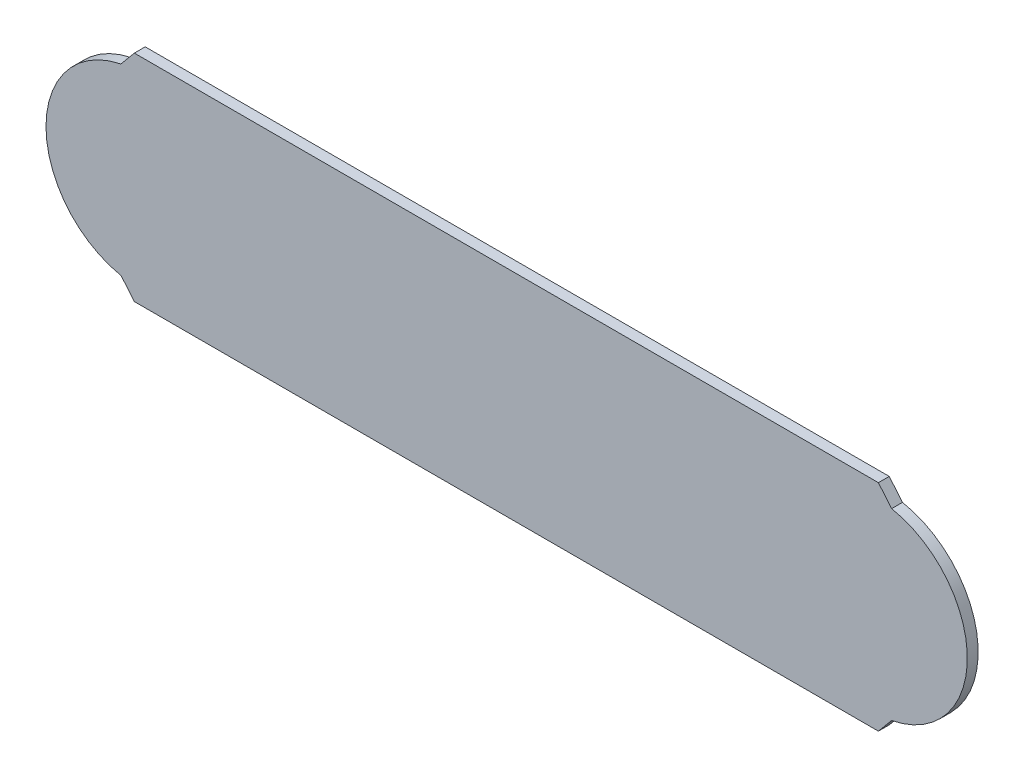
ISO-10303-21;
HEADER;
FILE_DESCRIPTION(('STEP AP214'),'2;1');
FILE_NAME('part.step','',(''),(''),'','','');
FILE_SCHEMA(('AUTOMOTIVE_DESIGN { 1 0 10303 214 1 1 1 1 }'));
ENDSEC;
DATA;
#1=APPLICATION_CONTEXT('core data for automotive mechanical design processes');
#2=APPLICATION_PROTOCOL_DEFINITION('international standard','automotive_design',2000,#1);
#3=PRODUCT_CONTEXT('',#1,'mechanical');
#4=PRODUCT('Part','Part','',(#3));
#5=PRODUCT_RELATED_PRODUCT_CATEGORY('part','',(#4));
#6=PRODUCT_DEFINITION_FORMATION('','',#4);
#7=PRODUCT_DEFINITION_CONTEXT('part definition',#1,'design');
#8=PRODUCT_DEFINITION('design','',#6,#7);
#9=PRODUCT_DEFINITION_SHAPE('','',#8);
#10=(LENGTH_UNIT() NAMED_UNIT(*) SI_UNIT(.MILLI.,.METRE.));
#11=(NAMED_UNIT(*) PLANE_ANGLE_UNIT() SI_UNIT($,.RADIAN.));
#12=(NAMED_UNIT(*) SI_UNIT($,.STERADIAN.) SOLID_ANGLE_UNIT());
#13=UNCERTAINTY_MEASURE_WITH_UNIT(LENGTH_MEASURE(1.E-05),#10,'distance_accuracy_value','');
#14=(GEOMETRIC_REPRESENTATION_CONTEXT(3) GLOBAL_UNCERTAINTY_ASSIGNED_CONTEXT((#13)) GLOBAL_UNIT_ASSIGNED_CONTEXT((#10,
#11,#12)) REPRESENTATION_CONTEXT('',''));
#15=CARTESIAN_POINT('',(0.,0.,0.));
#16=DIRECTION('',(0.,0.,1.));
#17=DIRECTION('',(1.,0.,0.));
#18=AXIS2_PLACEMENT_3D('',#15,#16,#17);
#19=CARTESIAN_POINT('',(25.7431576551753,-10.1499722540437,1.6));
#20=DIRECTION('',(-0.768638191384628,0.63968377402039,0.));
#21=DIRECTION('',(-0.639683774020389,-0.768638191384628,0.));
#22=AXIS2_PLACEMENT_3D('',#19,#20,#21);
#23=PLANE('',#22);
#24=DIRECTION('',(0.639683774020389,0.768638191384628,0.));
#25=VECTOR('',#24,1.);
#26=CARTESIAN_POINT('',(25.7431576551753,-10.1499722540437,0.4));
#27=LINE('',#26,#25);
#28=CARTESIAN_POINT('',(24.2809411612615,-11.9069582632884,0.4));
#29=VERTEX_POINT('',#28);
#30=CARTESIAN_POINT('',(25.7431576551753,-10.1499722540437,0.4));
#31=VERTEX_POINT('',#30);
#32=EDGE_CURVE('E141',#29,#31,#27,.T.);
#33=ORIENTED_EDGE('',*,*,#32,.T.);
#34=DIRECTION('',(0.,0.,-1.));
#35=VECTOR('',#34,1.);
#36=CARTESIAN_POINT('',(25.7431576551753,-10.1499722540437,1.6));
#37=LINE('',#36,#35);
#38=CARTESIAN_POINT('',(25.7431576551753,-10.1499722540437,1.6));
#39=VERTEX_POINT('',#38);
#40=EDGE_CURVE('E11',#39,#31,#37,.T.);
#41=ORIENTED_EDGE('',*,*,#40,.F.);
#42=DIRECTION('',(0.639683774020389,0.768638191384628,0.));
#43=VECTOR('',#42,1.);
#44=CARTESIAN_POINT('',(25.7431576551753,-10.1499722540437,1.6));
#45=LINE('',#44,#43);
#46=CARTESIAN_POINT('',(24.2809411612615,-11.9069582632884,1.6));
#47=VERTEX_POINT('',#46);
#48=EDGE_CURVE('E157',#47,#39,#45,.T.);
#49=ORIENTED_EDGE('',*,*,#48,.F.);
#50=DIRECTION('',(0.,0.,-1.));
#51=VECTOR('',#50,1.);
#52=CARTESIAN_POINT('',(24.2809411612615,-11.9069582632884,1.6));
#53=LINE('',#52,#51);
#54=EDGE_CURVE('E137',#47,#29,#53,.T.);
#55=ORIENTED_EDGE('',*,*,#54,.T.);
#56=EDGE_LOOP('',(#33,#41,#49,#55));
#57=FACE_BOUND('',#56,.T.);
#58=ADVANCED_FACE('F39',(#57),#23,.F.);
#59=CARTESIAN_POINT('',(23.7819147151548,-0.000454992943589456,1.6));
#60=DIRECTION('',(0.,0.,-1.));
#61=DIRECTION('',(-1.,0.,0.));
#62=AXIS2_PLACEMENT_3D('',#59,#60,#61);
#63=CYLINDRICAL_SURFACE('',#62,10.3372711342573);
#64=CARTESIAN_POINT('',(23.7819147151548,-0.000454992943589456,0.4));
#65=DIRECTION('',(0.,0.,1.));
#66=DIRECTION('',(1.,0.,0.));
#67=AXIS2_PLACEMENT_3D('',#64,#65,#66);
#68=CIRCLE('',#67,10.3372711342573);
#69=CARTESIAN_POINT('',(25.7431576551794,10.1490622681557,0.4));
#70=VERTEX_POINT('',#69);
#71=EDGE_CURVE('E144',#31,#70,#68,.T.);
#72=ORIENTED_EDGE('',*,*,#71,.T.);
#73=DIRECTION('',(0.,0.,-1.));
#74=VECTOR('',#73,1.);
#75=CARTESIAN_POINT('',(25.7431576551794,10.1490622681557,1.6));
#76=LINE('',#75,#74);
#77=CARTESIAN_POINT('',(25.7431576551794,10.1490622681557,1.6));
#78=VERTEX_POINT('',#77);
#79=EDGE_CURVE('E47',#78,#70,#76,.T.);
#80=ORIENTED_EDGE('',*,*,#79,.F.);
#81=CARTESIAN_POINT('',(23.7819147151548,-0.000454992943589456,1.6));
#82=DIRECTION('',(0.,0.,1.));
#83=DIRECTION('',(1.,0.,0.));
#84=AXIS2_PLACEMENT_3D('',#81,#82,#83);
#85=CIRCLE('',#84,10.3372711342573);
#86=EDGE_CURVE('E101',#39,#78,#85,.T.);
#87=ORIENTED_EDGE('',*,*,#86,.F.);
#88=ORIENTED_EDGE('',*,*,#40,.T.);
#89=EDGE_LOOP('',(#72,#80,#87,#88));
#90=FACE_BOUND('',#89,.T.);
#91=ADVANCED_FACE('F200',(#90),#63,.T.);
#92=CARTESIAN_POINT('',(25.7431576551794,10.1490622681557,1.6));
#93=DIRECTION('',(-0.768638191384177,-0.639683774020931,0.));
#94=DIRECTION('',(0.639683774020931,-0.768638191384177,0.));
#95=AXIS2_PLACEMENT_3D('',#92,#93,#94);
#96=PLANE('',#95);
#97=DIRECTION('',(-0.639683774020931,0.768638191384177,0.));
#98=VECTOR('',#97,1.);
#99=CARTESIAN_POINT('',(25.7431576551794,10.1490622681557,0.4));
#100=LINE('',#99,#98);
#101=CARTESIAN_POINT('',(24.2809411612615,11.9060482774028,0.4));
#102=VERTEX_POINT('',#101);
#103=EDGE_CURVE('E146',#70,#102,#100,.T.);
#104=ORIENTED_EDGE('',*,*,#103,.T.);
#105=DIRECTION('',(0.,0.,-1.));
#106=VECTOR('',#105,1.);
#107=CARTESIAN_POINT('',(24.2809411612615,11.9060482774028,1.6));
#108=LINE('',#107,#106);
#109=CARTESIAN_POINT('',(24.2809411612615,11.9060482774028,1.6));
#110=VERTEX_POINT('',#109);
#111=EDGE_CURVE('E167',#110,#102,#108,.T.);
#112=ORIENTED_EDGE('',*,*,#111,.F.);
#113=DIRECTION('',(-0.639683774020931,0.768638191384177,0.));
#114=VECTOR('',#113,1.);
#115=CARTESIAN_POINT('',(25.7431576551794,10.1490622681557,1.6));
#116=LINE('',#115,#114);
#117=EDGE_CURVE('E175',#78,#110,#116,.T.);
#118=ORIENTED_EDGE('',*,*,#117,.F.);
#119=ORIENTED_EDGE('',*,*,#79,.T.);
#120=EDGE_LOOP('',(#104,#112,#118,#119));
#121=FACE_BOUND('',#120,.T.);
#122=ADVANCED_FACE('F173',(#121),#96,.F.);
#123=CARTESIAN_POINT('',(-58.0472208028864,11.9060482774028,1.6));
#124=DIRECTION('',(0.,-1.,0.));
#125=DIRECTION('',(0.,0.,-1.));
#126=AXIS2_PLACEMENT_3D('',#123,#124,#125);
#127=PLANE('',#126);
#128=DIRECTION('',(-1.,0.,0.));
#129=VECTOR('',#128,1.);
#130=CARTESIAN_POINT('',(-58.0472208028864,11.9060482774028,0.4));
#131=LINE('',#130,#129);
#132=CARTESIAN_POINT('',(-58.0472208028864,11.9060482774028,0.4));
#133=VERTEX_POINT('',#132);
#134=EDGE_CURVE('E148',#102,#133,#131,.T.);
#135=ORIENTED_EDGE('',*,*,#134,.T.);
#136=DIRECTION('',(0.,0.,-1.));
#137=VECTOR('',#136,1.);
#138=CARTESIAN_POINT('',(-58.0472208028864,11.9060482774028,1.6));
#139=LINE('',#138,#137);
#140=CARTESIAN_POINT('',(-58.0472208028864,11.9060482774028,1.6));
#141=VERTEX_POINT('',#140);
#142=EDGE_CURVE('E164',#141,#133,#139,.T.);
#143=ORIENTED_EDGE('',*,*,#142,.F.);
#144=DIRECTION('',(-1.,0.,0.));
#145=VECTOR('',#144,1.);
#146=CARTESIAN_POINT('',(-58.0472208028864,11.9060482774028,1.6));
#147=LINE('',#146,#145);
#148=EDGE_CURVE('E191',#110,#141,#147,.T.);
#149=ORIENTED_EDGE('',*,*,#148,.F.);
#150=ORIENTED_EDGE('',*,*,#111,.T.);
#151=EDGE_LOOP('',(#135,#143,#149,#150));
#152=FACE_BOUND('',#151,.T.);
#153=ADVANCED_FACE('F184',(#152),#127,.F.);
#154=CARTESIAN_POINT('',(-59.5094372968042,10.1490622681557,1.6));
#155=DIRECTION('',(0.76863819138418,-0.639683774020927,0.));
#156=DIRECTION('',(0.639683774020927,0.76863819138418,0.));
#157=AXIS2_PLACEMENT_3D('',#154,#155,#156);
#158=PLANE('',#157);
#159=DIRECTION('',(-0.639683774020927,-0.76863819138418,0.));
#160=VECTOR('',#159,1.);
#161=CARTESIAN_POINT('',(-59.5094372968042,10.1490622681557,0.4));
#162=LINE('',#161,#160);
#163=CARTESIAN_POINT('',(-59.5094372968043,10.1490622681557,0.4));
#164=VERTEX_POINT('',#163);
#165=EDGE_CURVE('E150',#133,#164,#162,.T.);
#166=ORIENTED_EDGE('',*,*,#165,.T.);
#167=DIRECTION('',(0.,0.,-1.));
#168=VECTOR('',#167,1.);
#169=CARTESIAN_POINT('',(-59.5094372968043,10.1490622681557,1.6));
#170=LINE('',#169,#168);
#171=CARTESIAN_POINT('',(-59.5094372968043,10.1490622681557,1.6));
#172=VERTEX_POINT('',#171);
#173=EDGE_CURVE('E161',#172,#164,#170,.T.);
#174=ORIENTED_EDGE('',*,*,#173,.F.);
#175=DIRECTION('',(-0.639683774020927,-0.76863819138418,0.));
#176=VECTOR('',#175,1.);
#177=CARTESIAN_POINT('',(-59.5094372968042,10.1490622681557,1.6));
#178=LINE('',#177,#176);
#179=EDGE_CURVE('E190',#141,#172,#178,.T.);
#180=ORIENTED_EDGE('',*,*,#179,.F.);
#181=ORIENTED_EDGE('',*,*,#142,.T.);
#182=EDGE_LOOP('',(#166,#174,#180,#181));
#183=FACE_BOUND('',#182,.T.);
#184=ADVANCED_FACE('F188',(#183),#158,.F.);
#185=CARTESIAN_POINT('',(-59.618236678937,10.2396083796473,1.6));
#186=DIRECTION('',(0.,0.,-1.));
#187=DIRECTION('',(-1.,0.,0.));
#188=AXIS2_PLACEMENT_3D('',#185,#186,#187);
#189=CYLINDRICAL_SURFACE('',#188,0.141548238628053);
#190=CARTESIAN_POINT('',(-59.618236678937,10.2396083796473,0.4));
#191=DIRECTION('',(0.,0.,-1.));
#192=DIRECTION('',(-1.,0.,0.));
#193=AXIS2_PLACEMENT_3D('',#190,#191,#192);
#194=CIRCLE('',#193,0.141548238628053);
#195=CARTESIAN_POINT('',(-59.5483459205335,10.1165182267167,0.4));
#196=VERTEX_POINT('',#195);
#197=EDGE_CURVE('E152',#164,#196,#194,.T.);
#198=ORIENTED_EDGE('',*,*,#197,.T.);
#199=DIRECTION('',(0.,0.,-1.));
#200=VECTOR('',#199,1.);
#201=CARTESIAN_POINT('',(-59.5483459205335,10.1165182267167,1.6));
#202=LINE('',#201,#200);
#203=CARTESIAN_POINT('',(-59.5483459205335,10.1165182267167,1.6));
#204=VERTEX_POINT('',#203);
#205=EDGE_CURVE('E132',#204,#196,#202,.T.);
#206=ORIENTED_EDGE('',*,*,#205,.F.);
#207=CARTESIAN_POINT('',(-59.618236678937,10.2396083796473,1.6));
#208=DIRECTION('',(0.,0.,-1.));
#209=DIRECTION('',(-1.,0.,0.));
#210=AXIS2_PLACEMENT_3D('',#207,#208,#209);
#211=CIRCLE('',#210,0.141548238628053);
#212=EDGE_CURVE('E123',#172,#204,#211,.T.);
#213=ORIENTED_EDGE('',*,*,#212,.F.);
#214=ORIENTED_EDGE('',*,*,#173,.T.);
#215=EDGE_LOOP('',(#198,#206,#213,#214));
#216=FACE_BOUND('',#215,.T.);
#217=ADVANCED_FACE('F212',(#216),#189,.F.);
#218=CARTESIAN_POINT('',(-57.4853355074646,-0.0128036922825941,1.6));
#219=DIRECTION('',(0.,0.,-1.));
#220=DIRECTION('',(-1.,0.,0.));
#221=AXIS2_PLACEMENT_3D('',#218,#219,#220);
#222=CYLINDRICAL_SURFACE('',#221,10.3372711342573);
#223=CARTESIAN_POINT('',(-57.4853355074646,-0.0128036922825941,0.4));
#224=DIRECTION('',(0.,0.,1.));
#225=DIRECTION('',(-1.,0.,0.));
#226=AXIS2_PLACEMENT_3D('',#223,#224,#225);
#227=CIRCLE('',#226,10.3372711342573);
#228=CARTESIAN_POINT('',(-59.5094372968002,-10.1499722540437,0.4));
#229=VERTEX_POINT('',#228);
#230=EDGE_CURVE('E131',#196,#229,#227,.T.);
#231=ORIENTED_EDGE('',*,*,#230,.T.);
#232=DIRECTION('',(0.,0.,-1.));
#233=VECTOR('',#232,1.);
#234=CARTESIAN_POINT('',(-59.5094372968002,-10.1499722540437,1.6));
#235=LINE('',#234,#233);
#236=CARTESIAN_POINT('',(-59.5094372968002,-10.1499722540437,1.6));
#237=VERTEX_POINT('',#236);
#238=EDGE_CURVE('E128',#237,#229,#235,.T.);
#239=ORIENTED_EDGE('',*,*,#238,.F.);
#240=CARTESIAN_POINT('',(-57.4853355074646,-0.0128036922825941,1.6));
#241=DIRECTION('',(0.,0.,1.));
#242=DIRECTION('',(-1.,0.,0.));
#243=AXIS2_PLACEMENT_3D('',#240,#241,#242);
#244=CIRCLE('',#243,10.3372711342573);
#245=EDGE_CURVE('E117',#204,#237,#244,.T.);
#246=ORIENTED_EDGE('',*,*,#245,.F.);
#247=ORIENTED_EDGE('',*,*,#205,.T.);
#248=EDGE_LOOP('',(#231,#239,#246,#247));
#249=FACE_BOUND('',#248,.T.);
#250=ADVANCED_FACE('F129',(#249),#222,.T.);
#251=CARTESIAN_POINT('',(-59.5094372968002,-10.1499722540437,1.6));
#252=DIRECTION('',(0.768638191384628,0.63968377402039,0.));
#253=DIRECTION('',(-0.639683774020389,0.768638191384628,0.));
#254=AXIS2_PLACEMENT_3D('',#251,#252,#253);
#255=PLANE('',#254);
#256=DIRECTION('',(0.639683774020389,-0.768638191384628,0.));
#257=VECTOR('',#256,1.);
#258=CARTESIAN_POINT('',(-59.5094372968002,-10.1499722540437,0.4));
#259=LINE('',#258,#257);
#260=CARTESIAN_POINT('',(-58.0472208028864,-11.9069582632884,0.4));
#261=VERTEX_POINT('',#260);
#262=EDGE_CURVE('E87',#229,#261,#259,.T.);
#263=ORIENTED_EDGE('',*,*,#262,.T.);
#264=DIRECTION('',(0.,0.,-1.));
#265=VECTOR('',#264,1.);
#266=CARTESIAN_POINT('',(-58.0472208028864,-11.9069582632884,1.6));
#267=LINE('',#266,#265);
#268=CARTESIAN_POINT('',(-58.0472208028864,-11.9069582632884,1.6));
#269=VERTEX_POINT('',#268);
#270=EDGE_CURVE('E133',#269,#261,#267,.T.);
#271=ORIENTED_EDGE('',*,*,#270,.F.);
#272=DIRECTION('',(0.639683774020389,-0.768638191384628,0.));
#273=VECTOR('',#272,1.);
#274=CARTESIAN_POINT('',(-59.5094372968002,-10.1499722540437,1.6));
#275=LINE('',#274,#273);
#276=EDGE_CURVE('E121',#237,#269,#275,.T.);
#277=ORIENTED_EDGE('',*,*,#276,.F.);
#278=ORIENTED_EDGE('',*,*,#238,.T.);
#279=EDGE_LOOP('',(#263,#271,#277,#278));
#280=FACE_BOUND('',#279,.T.);
#281=ADVANCED_FACE('F135',(#280),#255,.F.);
#282=CARTESIAN_POINT('',(-58.0472208028864,-11.9069582632884,1.6));
#283=DIRECTION('',(0.,1.,0.));
#284=DIRECTION('',(0.,0.,1.));
#285=AXIS2_PLACEMENT_3D('',#282,#283,#284);
#286=PLANE('',#285);
#287=DIRECTION('',(1.,0.,0.));
#288=VECTOR('',#287,1.);
#289=CARTESIAN_POINT('',(-58.0472208028864,-11.9069582632884,0.4));
#290=LINE('',#289,#288);
#291=EDGE_CURVE('E93',#261,#29,#290,.T.);
#292=ORIENTED_EDGE('',*,*,#291,.T.);
#293=ORIENTED_EDGE('',*,*,#54,.F.);
#294=DIRECTION('',(1.,0.,0.));
#295=VECTOR('',#294,1.);
#296=CARTESIAN_POINT('',(-58.0472208028864,-11.9069582632884,1.6));
#297=LINE('',#296,#295);
#298=EDGE_CURVE('E55',#269,#47,#297,.T.);
#299=ORIENTED_EDGE('',*,*,#298,.F.);
#300=ORIENTED_EDGE('',*,*,#270,.T.);
#301=EDGE_LOOP('',(#292,#293,#299,#300));
#302=FACE_BOUND('',#301,.T.);
#303=ADVANCED_FACE('F220',(#302),#286,.F.);
#304=CARTESIAN_POINT('',(-57.4853355074646,-0.0128036922825941,1.6));
#305=DIRECTION('',(0.,0.,-1.));
#306=DIRECTION('',(-1.,0.,0.));
#307=AXIS2_PLACEMENT_3D('',#304,#305,#306);
#308=PLANE('',#307);
#309=ORIENTED_EDGE('',*,*,#48,.T.);
#310=ORIENTED_EDGE('',*,*,#86,.T.);
#311=ORIENTED_EDGE('',*,*,#117,.T.);
#312=ORIENTED_EDGE('',*,*,#148,.T.);
#313=ORIENTED_EDGE('',*,*,#179,.T.);
#314=ORIENTED_EDGE('',*,*,#212,.T.);
#315=ORIENTED_EDGE('',*,*,#245,.T.);
#316=ORIENTED_EDGE('',*,*,#276,.T.);
#317=ORIENTED_EDGE('',*,*,#298,.T.);
#318=EDGE_LOOP('',(#309,#310,#311,#312,#313,#314,#315,#316,#317));
#319=FACE_BOUND('',#318,.T.);
#320=ADVANCED_FACE('F119',(#319),#308,.F.);
#321=CARTESIAN_POINT('',(-57.4853355074646,-0.0128036922825941,0.4));
#322=DIRECTION('',(0.,0.,-1.));
#323=DIRECTION('',(-1.,0.,0.));
#324=AXIS2_PLACEMENT_3D('',#321,#322,#323);
#325=PLANE('',#324);
#326=ORIENTED_EDGE('',*,*,#32,.F.);
#327=ORIENTED_EDGE('',*,*,#291,.F.);
#328=ORIENTED_EDGE('',*,*,#262,.F.);
#329=ORIENTED_EDGE('',*,*,#230,.F.);
#330=ORIENTED_EDGE('',*,*,#197,.F.);
#331=ORIENTED_EDGE('',*,*,#165,.F.);
#332=ORIENTED_EDGE('',*,*,#134,.F.);
#333=ORIENTED_EDGE('',*,*,#103,.F.);
#334=ORIENTED_EDGE('',*,*,#71,.F.);
#335=EDGE_LOOP('',(#326,#327,#328,#329,#330,#331,#332,#333,#334));
#336=FACE_BOUND('',#335,.T.);
#337=ADVANCED_FACE('F179',(#336),#325,.T.);
#338=CLOSED_SHELL('',(#58,#91,#122,#153,#184,#217,#250,#281,#303,#320,#337));
#339=MANIFOLD_SOLID_BREP('B2',#338);
#340=ADVANCED_BREP_SHAPE_REPRESENTATION('',(#18,#339),#14);
#341=SHAPE_DEFINITION_REPRESENTATION(#9,#340);
ENDSEC;
END-ISO-10303-21;
